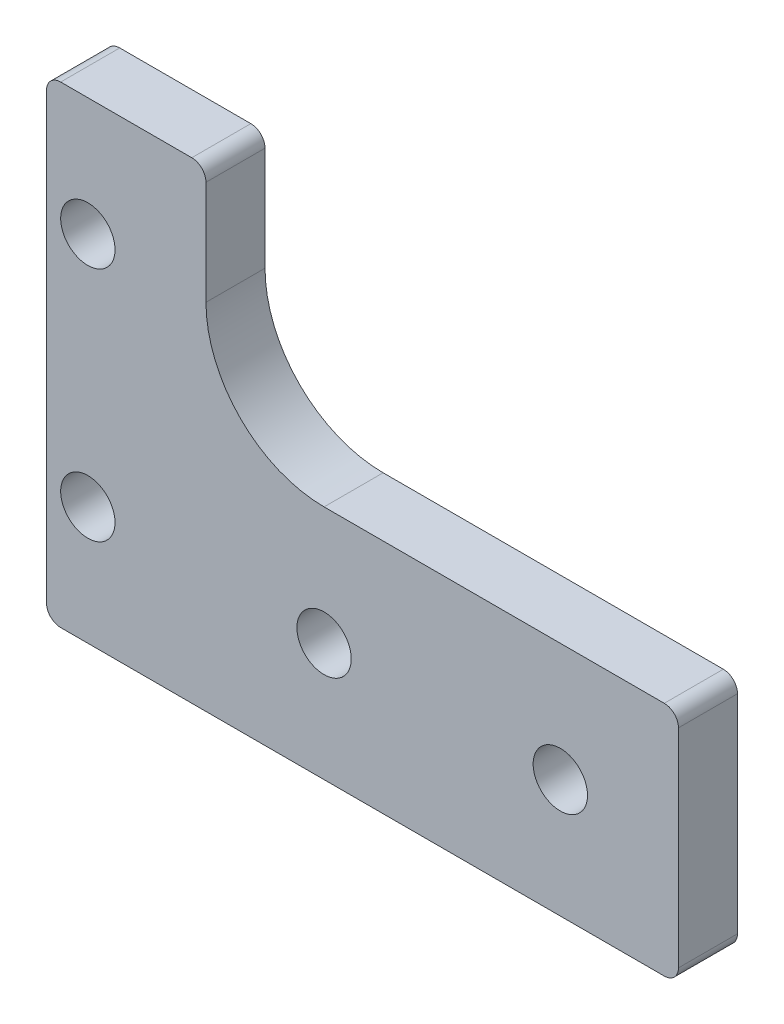
ISO-10303-21;
HEADER;
FILE_DESCRIPTION(('STEP AP214'),'2;1');
FILE_NAME('part.step','',(''),(''),'','','');
FILE_SCHEMA(('AUTOMOTIVE_DESIGN { 1 0 10303 214 1 1 1 1 }'));
ENDSEC;
DATA;
#1=APPLICATION_CONTEXT('core data for automotive mechanical design processes');
#2=APPLICATION_PROTOCOL_DEFINITION('international standard','automotive_design',2000,#1);
#3=PRODUCT_CONTEXT('',#1,'mechanical');
#4=PRODUCT('Part','Part','',(#3));
#5=PRODUCT_RELATED_PRODUCT_CATEGORY('part','',(#4));
#6=PRODUCT_DEFINITION_FORMATION('','',#4);
#7=PRODUCT_DEFINITION_CONTEXT('part definition',#1,'design');
#8=PRODUCT_DEFINITION('design','',#6,#7);
#9=PRODUCT_DEFINITION_SHAPE('','',#8);
#10=(LENGTH_UNIT() NAMED_UNIT(*) SI_UNIT(.MILLI.,.METRE.));
#11=(NAMED_UNIT(*) PLANE_ANGLE_UNIT() SI_UNIT($,.RADIAN.));
#12=(NAMED_UNIT(*) SI_UNIT($,.STERADIAN.) SOLID_ANGLE_UNIT());
#13=UNCERTAINTY_MEASURE_WITH_UNIT(LENGTH_MEASURE(1.E-05),#10,'distance_accuracy_value','');
#14=(GEOMETRIC_REPRESENTATION_CONTEXT(3) GLOBAL_UNCERTAINTY_ASSIGNED_CONTEXT((#13)) GLOBAL_UNIT_ASSIGNED_CONTEXT((#10,
#11,#12)) REPRESENTATION_CONTEXT('',''));
#15=CARTESIAN_POINT('',(0.,0.,0.));
#16=DIRECTION('',(0.,0.,1.));
#17=DIRECTION('',(1.,0.,0.));
#18=AXIS2_PLACEMENT_3D('',#15,#16,#17);
#19=CARTESIAN_POINT('',(76.2,0.,6.35));
#20=DIRECTION('',(0.,1.,0.));
#21=DIRECTION('',(-1.,0.,0.));
#22=AXIS2_PLACEMENT_3D('',#19,#20,#21);
#23=PLANE('',#22);
#24=DIRECTION('',(1.,0.,0.));
#25=VECTOR('',#24,1.);
#26=CARTESIAN_POINT('',(76.2,0.,0.));
#27=LINE('',#26,#25);
#28=CARTESIAN_POINT('',(9.77900000000002,0.,0.));
#29=VERTEX_POINT('',#28);
#30=CARTESIAN_POINT('',(74.676,0.,0.));
#31=VERTEX_POINT('',#30);
#32=EDGE_CURVE('E254',#29,#31,#27,.T.);
#33=ORIENTED_EDGE('',*,*,#32,.T.);
#34=DIRECTION('',(0.,0.,-1.));
#35=VECTOR('',#34,1.);
#36=CARTESIAN_POINT('',(74.676,0.,6.35));
#37=LINE('',#36,#35);
#38=CARTESIAN_POINT('',(74.676,0.,6.35));
#39=VERTEX_POINT('',#38);
#40=EDGE_CURVE('E196',#31,#39,#37,.F.);
#41=ORIENTED_EDGE('',*,*,#40,.T.);
#42=DIRECTION('',(1.,0.,0.));
#43=VECTOR('',#42,1.);
#44=CARTESIAN_POINT('',(76.2,0.,6.35));
#45=LINE('',#44,#43);
#46=CARTESIAN_POINT('',(9.77900000000002,0.,6.35));
#47=VERTEX_POINT('',#46);
#48=EDGE_CURVE('E162',#47,#39,#45,.T.);
#49=ORIENTED_EDGE('',*,*,#48,.F.);
#50=DIRECTION('',(0.,0.,1.));
#51=VECTOR('',#50,1.);
#52=CARTESIAN_POINT('',(9.779,0.,6.35));
#53=LINE('',#52,#51);
#54=EDGE_CURVE('E193',#47,#29,#53,.F.);
#55=ORIENTED_EDGE('',*,*,#54,.T.);
#56=EDGE_LOOP('',(#33,#41,#49,#55));
#57=FACE_BOUND('',#56,.T.);
#58=ADVANCED_FACE('F39',(#57),#23,.F.);
#59=CARTESIAN_POINT('',(76.2,25.4,6.35));
#60=DIRECTION('',(-1.,0.,0.));
#61=DIRECTION('',(0.,0.,1.));
#62=AXIS2_PLACEMENT_3D('',#59,#60,#61);
#63=PLANE('',#62);
#64=DIRECTION('',(0.,1.,0.));
#65=VECTOR('',#64,1.);
#66=CARTESIAN_POINT('',(76.2,25.4,6.35));
#67=LINE('',#66,#65);
#68=CARTESIAN_POINT('',(76.2,1.524,6.35));
#69=VERTEX_POINT('',#68);
#70=CARTESIAN_POINT('',(76.2,23.876,6.35));
#71=VERTEX_POINT('',#70);
#72=EDGE_CURVE('E271',#69,#71,#67,.T.);
#73=ORIENTED_EDGE('',*,*,#72,.F.);
#74=DIRECTION('',(0.,0.,-1.));
#75=VECTOR('',#74,1.);
#76=CARTESIAN_POINT('',(76.2,1.524,6.35));
#77=LINE('',#76,#75);
#78=CARTESIAN_POINT('',(76.2,1.524,0.));
#79=VERTEX_POINT('',#78);
#80=EDGE_CURVE('E175',#69,#79,#77,.T.);
#81=ORIENTED_EDGE('',*,*,#80,.T.);
#82=DIRECTION('',(0.,1.,0.));
#83=VECTOR('',#82,1.);
#84=CARTESIAN_POINT('',(76.2,25.4,0.));
#85=LINE('',#84,#83);
#86=CARTESIAN_POINT('',(76.2,23.876,0.));
#87=VERTEX_POINT('',#86);
#88=EDGE_CURVE('E164',#79,#87,#85,.T.);
#89=ORIENTED_EDGE('',*,*,#88,.T.);
#90=DIRECTION('',(0.,0.,-1.));
#91=VECTOR('',#90,1.);
#92=CARTESIAN_POINT('',(76.2,23.876,6.35));
#93=LINE('',#92,#91);
#94=EDGE_CURVE('E172',#87,#71,#93,.F.);
#95=ORIENTED_EDGE('',*,*,#94,.T.);
#96=EDGE_LOOP('',(#73,#81,#89,#95));
#97=FACE_BOUND('',#96,.T.);
#98=ADVANCED_FACE('F263',(#97),#63,.F.);
#99=CARTESIAN_POINT('',(25.4,25.4,6.35));
#100=DIRECTION('',(0.,-1.,0.));
#101=DIRECTION('',(1.,0.,0.));
#102=AXIS2_PLACEMENT_3D('',#99,#100,#101);
#103=PLANE('',#102);
#104=DIRECTION('',(-1.,0.,0.));
#105=VECTOR('',#104,1.);
#106=CARTESIAN_POINT('',(25.4,25.4,6.35));
#107=LINE('',#106,#105);
#108=CARTESIAN_POINT('',(74.676,25.4,6.35));
#109=VERTEX_POINT('',#108);
#110=CARTESIAN_POINT('',(38.1,25.4,6.35));
#111=VERTEX_POINT('',#110);
#112=EDGE_CURVE('E250',#109,#111,#107,.T.);
#113=ORIENTED_EDGE('',*,*,#112,.F.);
#114=DIRECTION('',(0.,0.,-1.));
#115=VECTOR('',#114,1.);
#116=CARTESIAN_POINT('',(74.676,25.4,6.35));
#117=LINE('',#116,#115);
#118=CARTESIAN_POINT('',(74.676,25.4,0.));
#119=VERTEX_POINT('',#118);
#120=EDGE_CURVE('E213',#109,#119,#117,.T.);
#121=ORIENTED_EDGE('',*,*,#120,.T.);
#122=DIRECTION('',(-1.,0.,0.));
#123=VECTOR('',#122,1.);
#124=CARTESIAN_POINT('',(25.4,25.4,0.));
#125=LINE('',#124,#123);
#126=CARTESIAN_POINT('',(38.1,25.4,0.));
#127=VERTEX_POINT('',#126);
#128=EDGE_CURVE('E157',#119,#127,#125,.T.);
#129=ORIENTED_EDGE('',*,*,#128,.T.);
#130=DIRECTION('',(0.,0.,-1.));
#131=VECTOR('',#130,1.);
#132=CARTESIAN_POINT('',(38.1,25.4,6.35));
#133=LINE('',#132,#131);
#134=EDGE_CURVE('E137',#127,#111,#133,.F.);
#135=ORIENTED_EDGE('',*,*,#134,.T.);
#136=EDGE_LOOP('',(#113,#121,#129,#135));
#137=FACE_BOUND('',#136,.T.);
#138=ADVANCED_FACE('F269',(#137),#103,.F.);
#139=CARTESIAN_POINT('',(25.4,50.8,6.35));
#140=DIRECTION('',(-1.,0.,0.));
#141=DIRECTION('',(0.,-1.,0.));
#142=AXIS2_PLACEMENT_3D('',#139,#140,#141);
#143=PLANE('',#142);
#144=DIRECTION('',(0.,1.,0.));
#145=VECTOR('',#144,1.);
#146=CARTESIAN_POINT('',(25.4,50.8,0.));
#147=LINE('',#146,#145);
#148=CARTESIAN_POINT('',(25.4,38.1,0.));
#149=VERTEX_POINT('',#148);
#150=CARTESIAN_POINT('',(25.4,49.276,0.));
#151=VERTEX_POINT('',#150);
#152=EDGE_CURVE('E145',#149,#151,#147,.T.);
#153=ORIENTED_EDGE('',*,*,#152,.T.);
#154=DIRECTION('',(0.,0.,-1.));
#155=VECTOR('',#154,1.);
#156=CARTESIAN_POINT('',(25.4,49.276,6.35));
#157=LINE('',#156,#155);
#158=CARTESIAN_POINT('',(25.4,49.276,6.35));
#159=VERTEX_POINT('',#158);
#160=EDGE_CURVE('E11',#151,#159,#157,.F.);
#161=ORIENTED_EDGE('',*,*,#160,.T.);
#162=DIRECTION('',(0.,1.,0.));
#163=VECTOR('',#162,1.);
#164=CARTESIAN_POINT('',(25.4,50.8,6.35));
#165=LINE('',#164,#163);
#166=CARTESIAN_POINT('',(25.4,38.1,6.35));
#167=VERTEX_POINT('',#166);
#168=EDGE_CURVE('E146',#167,#159,#165,.T.);
#169=ORIENTED_EDGE('',*,*,#168,.F.);
#170=DIRECTION('',(0.,0.,-1.));
#171=VECTOR('',#170,1.);
#172=CARTESIAN_POINT('',(25.4,38.1,0.));
#173=LINE('',#172,#171);
#174=EDGE_CURVE('E135',#167,#149,#173,.T.);
#175=ORIENTED_EDGE('',*,*,#174,.T.);
#176=EDGE_LOOP('',(#153,#161,#169,#175));
#177=FACE_BOUND('',#176,.T.);
#178=ADVANCED_FACE('F144',(#177),#143,.F.);
#179=CARTESIAN_POINT('',(0.,50.8,6.35));
#180=DIRECTION('',(0.,-1.,0.));
#181=DIRECTION('',(0.,0.,-1.));
#182=AXIS2_PLACEMENT_3D('',#179,#180,#181);
#183=PLANE('',#182);
#184=DIRECTION('',(-1.,0.,0.));
#185=VECTOR('',#184,1.);
#186=CARTESIAN_POINT('',(0.,50.8,6.35));
#187=LINE('',#186,#185);
#188=CARTESIAN_POINT('',(23.876,50.8,6.35));
#189=VERTEX_POINT('',#188);
#190=CARTESIAN_POINT('',(9.779,50.8,6.35));
#191=VERTEX_POINT('',#190);
#192=EDGE_CURVE('E148',#189,#191,#187,.T.);
#193=ORIENTED_EDGE('',*,*,#192,.F.);
#194=DIRECTION('',(0.,0.,-1.));
#195=VECTOR('',#194,1.);
#196=CARTESIAN_POINT('',(23.876,50.8,6.35));
#197=LINE('',#196,#195);
#198=CARTESIAN_POINT('',(23.876,50.8,0.));
#199=VERTEX_POINT('',#198);
#200=EDGE_CURVE('E48',#189,#199,#197,.T.);
#201=ORIENTED_EDGE('',*,*,#200,.T.);
#202=DIRECTION('',(-1.,0.,0.));
#203=VECTOR('',#202,1.);
#204=CARTESIAN_POINT('',(0.,50.8,0.));
#205=LINE('',#204,#203);
#206=CARTESIAN_POINT('',(9.779,50.8,0.));
#207=VERTEX_POINT('',#206);
#208=EDGE_CURVE('E156',#199,#207,#205,.T.);
#209=ORIENTED_EDGE('',*,*,#208,.T.);
#210=DIRECTION('',(0.,0.,1.));
#211=VECTOR('',#210,1.);
#212=CARTESIAN_POINT('',(9.779,50.8,6.35));
#213=LINE('',#212,#211);
#214=EDGE_CURVE('E224',#207,#191,#213,.T.);
#215=ORIENTED_EDGE('',*,*,#214,.T.);
#216=EDGE_LOOP('',(#193,#201,#209,#215));
#217=FACE_BOUND('',#216,.T.);
#218=ADVANCED_FACE('F232',(#217),#183,.F.);
#219=CARTESIAN_POINT('',(0.,0.,6.35));
#220=DIRECTION('',(0.,0.,-1.));
#221=DIRECTION('',(-1.,0.,0.));
#222=AXIS2_PLACEMENT_3D('',#219,#220,#221);
#223=PLANE('',#222);
#224=CARTESIAN_POINT('',(12.7,38.1,6.35));
#225=DIRECTION('',(0.,0.,1.));
#226=DIRECTION('',(1.,0.,0.));
#227=AXIS2_PLACEMENT_3D('',#224,#225,#226);
#228=CIRCLE('',#227,2.921);
#229=CARTESIAN_POINT('',(15.621,38.1,6.35));
#230=VERTEX_POINT('',#229);
#231=EDGE_CURVE('E301',#230,#230,#228,.T.);
#232=ORIENTED_EDGE('',*,*,#231,.F.);
#233=EDGE_LOOP('',(#232));
#234=FACE_BOUND('',#233,.T.);
#235=CARTESIAN_POINT('',(12.7,12.7,6.35));
#236=DIRECTION('',(0.,0.,1.));
#237=DIRECTION('',(1.,0.,0.));
#238=AXIS2_PLACEMENT_3D('',#235,#236,#237);
#239=CIRCLE('',#238,2.921);
#240=CARTESIAN_POINT('',(15.621,12.7,6.35));
#241=VERTEX_POINT('',#240);
#242=EDGE_CURVE('E293',#241,#241,#239,.T.);
#243=ORIENTED_EDGE('',*,*,#242,.F.);
#244=EDGE_LOOP('',(#243));
#245=FACE_BOUND('',#244,.T.);
#246=CARTESIAN_POINT('',(38.1,12.7,6.35));
#247=DIRECTION('',(0.,0.,1.));
#248=DIRECTION('',(1.,0.,0.));
#249=AXIS2_PLACEMENT_3D('',#246,#247,#248);
#250=CIRCLE('',#249,2.921);
#251=CARTESIAN_POINT('',(41.021,12.7,6.35));
#252=VERTEX_POINT('',#251);
#253=EDGE_CURVE('E285',#252,#252,#250,.T.);
#254=ORIENTED_EDGE('',*,*,#253,.F.);
#255=EDGE_LOOP('',(#254));
#256=FACE_BOUND('',#255,.T.);
#257=CARTESIAN_POINT('',(63.5,12.7,6.35));
#258=DIRECTION('',(0.,0.,1.));
#259=DIRECTION('',(1.,0.,0.));
#260=AXIS2_PLACEMENT_3D('',#257,#258,#259);
#261=CIRCLE('',#260,2.92100000000001);
#262=CARTESIAN_POINT('',(66.421,12.7,6.35));
#263=VERTEX_POINT('',#262);
#264=EDGE_CURVE('E277',#263,#263,#261,.T.);
#265=ORIENTED_EDGE('',*,*,#264,.F.);
#266=EDGE_LOOP('',(#265));
#267=FACE_BOUND('',#266,.T.);
#268=ORIENTED_EDGE('',*,*,#48,.T.);
#269=CARTESIAN_POINT('',(74.676,1.524,6.35));
#270=DIRECTION('',(0.,0.,-1.));
#271=DIRECTION('',(-1.,0.,0.));
#272=AXIS2_PLACEMENT_3D('',#269,#270,#271);
#273=CIRCLE('',#272,1.524);
#274=EDGE_CURVE('E210',#39,#69,#273,.F.);
#275=ORIENTED_EDGE('',*,*,#274,.T.);
#276=ORIENTED_EDGE('',*,*,#72,.T.);
#277=CARTESIAN_POINT('',(74.676,23.876,6.35));
#278=DIRECTION('',(0.,0.,-1.));
#279=DIRECTION('',(-1.,0.,0.));
#280=AXIS2_PLACEMENT_3D('',#277,#278,#279);
#281=CIRCLE('',#280,1.524);
#282=EDGE_CURVE('E61',#71,#109,#281,.F.);
#283=ORIENTED_EDGE('',*,*,#282,.T.);
#284=ORIENTED_EDGE('',*,*,#112,.T.);
#285=CARTESIAN_POINT('',(38.1,38.1,6.35));
#286=DIRECTION('',(0.,0.,-1.));
#287=DIRECTION('',(-1.,0.,0.));
#288=AXIS2_PLACEMENT_3D('',#285,#286,#287);
#289=CIRCLE('',#288,12.7);
#290=EDGE_CURVE('E142',#111,#167,#289,.T.);
#291=ORIENTED_EDGE('',*,*,#290,.T.);
#292=ORIENTED_EDGE('',*,*,#168,.T.);
#293=CARTESIAN_POINT('',(23.876,49.276,6.35));
#294=DIRECTION('',(0.,0.,-1.));
#295=DIRECTION('',(-1.,0.,0.));
#296=AXIS2_PLACEMENT_3D('',#293,#294,#295);
#297=CIRCLE('',#296,1.524);
#298=EDGE_CURVE('E202',#159,#189,#297,.F.);
#299=ORIENTED_EDGE('',*,*,#298,.T.);
#300=ORIENTED_EDGE('',*,*,#192,.T.);
#301=CARTESIAN_POINT('',(9.779,49.276,6.35));
#302=DIRECTION('',(0.,0.,-1.));
#303=DIRECTION('',(-1.,0.,0.));
#304=AXIS2_PLACEMENT_3D('',#301,#302,#303);
#305=CIRCLE('',#304,1.524);
#306=CARTESIAN_POINT('',(8.255,49.276,6.35));
#307=VERTEX_POINT('',#306);
#308=EDGE_CURVE('E199',#191,#307,#305,.F.);
#309=ORIENTED_EDGE('',*,*,#308,.T.);
#310=DIRECTION('',(0.,1.,0.));
#311=VECTOR('',#310,1.);
#312=CARTESIAN_POINT('',(8.255,0.,6.35));
#313=LINE('',#312,#311);
#314=CARTESIAN_POINT('',(8.255,1.524,6.35));
#315=VERTEX_POINT('',#314);
#316=EDGE_CURVE('E308',#315,#307,#313,.T.);
#317=ORIENTED_EDGE('',*,*,#316,.F.);
#318=CARTESIAN_POINT('',(9.779,1.524,6.35));
#319=DIRECTION('',(0.,0.,-1.));
#320=DIRECTION('',(-1.,0.,0.));
#321=AXIS2_PLACEMENT_3D('',#318,#319,#320);
#322=CIRCLE('',#321,1.524);
#323=EDGE_CURVE('E205',#315,#47,#322,.F.);
#324=ORIENTED_EDGE('',*,*,#323,.T.);
#325=EDGE_LOOP('',(#268,#275,#276,#283,#284,#291,#292,#299,#300,#309,#317,#324));
#326=FACE_BOUND('',#325,.T.);
#327=ADVANCED_FACE('F244',(#234,#245,#256,#267,#326),#223,.F.);
#328=CARTESIAN_POINT('',(0.,0.,0.));
#329=DIRECTION('',(0.,0.,-1.));
#330=DIRECTION('',(-1.,0.,0.));
#331=AXIS2_PLACEMENT_3D('',#328,#329,#330);
#332=PLANE('',#331);
#333=ORIENTED_EDGE('',*,*,#88,.F.);
#334=CARTESIAN_POINT('',(74.676,1.524,0.));
#335=DIRECTION('',(0.,0.,-1.));
#336=DIRECTION('',(-1.,0.,0.));
#337=AXIS2_PLACEMENT_3D('',#334,#335,#336);
#338=CIRCLE('',#337,1.524);
#339=EDGE_CURVE('E190',#79,#31,#338,.T.);
#340=ORIENTED_EDGE('',*,*,#339,.T.);
#341=ORIENTED_EDGE('',*,*,#32,.F.);
#342=CARTESIAN_POINT('',(9.779,1.524,0.));
#343=DIRECTION('',(0.,0.,-1.));
#344=DIRECTION('',(-1.,0.,0.));
#345=AXIS2_PLACEMENT_3D('',#342,#343,#344);
#346=CIRCLE('',#345,1.524);
#347=CARTESIAN_POINT('',(8.255,1.524,0.));
#348=VERTEX_POINT('',#347);
#349=EDGE_CURVE('E184',#29,#348,#346,.T.);
#350=ORIENTED_EDGE('',*,*,#349,.T.);
#351=DIRECTION('',(0.,1.,0.));
#352=VECTOR('',#351,1.);
#353=CARTESIAN_POINT('',(8.255,0.,0.));
#354=LINE('',#353,#352);
#355=CARTESIAN_POINT('',(8.255,49.276,0.));
#356=VERTEX_POINT('',#355);
#357=EDGE_CURVE('E240',#348,#356,#354,.T.);
#358=ORIENTED_EDGE('',*,*,#357,.T.);
#359=CARTESIAN_POINT('',(9.779,49.276,0.));
#360=DIRECTION('',(0.,0.,-1.));
#361=DIRECTION('',(-1.,0.,0.));
#362=AXIS2_PLACEMENT_3D('',#359,#360,#361);
#363=CIRCLE('',#362,1.524);
#364=EDGE_CURVE('E179',#356,#207,#363,.T.);
#365=ORIENTED_EDGE('',*,*,#364,.T.);
#366=ORIENTED_EDGE('',*,*,#208,.F.);
#367=CARTESIAN_POINT('',(23.876,49.276,0.));
#368=DIRECTION('',(0.,0.,-1.));
#369=DIRECTION('',(-1.,0.,0.));
#370=AXIS2_PLACEMENT_3D('',#367,#368,#369);
#371=CIRCLE('',#370,1.524);
#372=EDGE_CURVE('E154',#199,#151,#371,.T.);
#373=ORIENTED_EDGE('',*,*,#372,.T.);
#374=ORIENTED_EDGE('',*,*,#152,.F.);
#375=CARTESIAN_POINT('',(38.1,38.1,0.));
#376=DIRECTION('',(0.,0.,-1.));
#377=DIRECTION('',(-1.,0.,0.));
#378=AXIS2_PLACEMENT_3D('',#375,#376,#377);
#379=CIRCLE('',#378,12.7);
#380=EDGE_CURVE('E131',#149,#127,#379,.F.);
#381=ORIENTED_EDGE('',*,*,#380,.T.);
#382=ORIENTED_EDGE('',*,*,#128,.F.);
#383=CARTESIAN_POINT('',(74.676,23.876,0.));
#384=DIRECTION('',(0.,0.,-1.));
#385=DIRECTION('',(-1.,0.,0.));
#386=AXIS2_PLACEMENT_3D('',#383,#384,#385);
#387=CIRCLE('',#386,1.524);
#388=EDGE_CURVE('E187',#119,#87,#387,.T.);
#389=ORIENTED_EDGE('',*,*,#388,.T.);
#390=EDGE_LOOP('',(#333,#340,#341,#350,#358,#365,#366,#373,#374,#381,#382,#389));
#391=FACE_BOUND('',#390,.T.);
#392=CARTESIAN_POINT('',(12.7,38.1,0.));
#393=DIRECTION('',(0.,0.,1.));
#394=DIRECTION('',(1.,0.,0.));
#395=AXIS2_PLACEMENT_3D('',#392,#393,#394);
#396=CIRCLE('',#395,2.921);
#397=CARTESIAN_POINT('',(15.621,38.1,0.));
#398=VERTEX_POINT('',#397);
#399=EDGE_CURVE('E257',#398,#398,#396,.T.);
#400=ORIENTED_EDGE('',*,*,#399,.T.);
#401=EDGE_LOOP('',(#400));
#402=FACE_BOUND('',#401,.T.);
#403=CARTESIAN_POINT('',(12.7,12.7,0.));
#404=DIRECTION('',(0.,0.,1.));
#405=DIRECTION('',(1.,0.,0.));
#406=AXIS2_PLACEMENT_3D('',#403,#404,#405);
#407=CIRCLE('',#406,2.921);
#408=CARTESIAN_POINT('',(15.621,12.7,0.));
#409=VERTEX_POINT('',#408);
#410=EDGE_CURVE('E297',#409,#409,#407,.T.);
#411=ORIENTED_EDGE('',*,*,#410,.T.);
#412=EDGE_LOOP('',(#411));
#413=FACE_BOUND('',#412,.T.);
#414=CARTESIAN_POINT('',(38.1,12.7,0.));
#415=DIRECTION('',(0.,0.,1.));
#416=DIRECTION('',(1.,0.,0.));
#417=AXIS2_PLACEMENT_3D('',#414,#415,#416);
#418=CIRCLE('',#417,2.921);
#419=CARTESIAN_POINT('',(41.021,12.7,0.));
#420=VERTEX_POINT('',#419);
#421=EDGE_CURVE('E289',#420,#420,#418,.T.);
#422=ORIENTED_EDGE('',*,*,#421,.T.);
#423=EDGE_LOOP('',(#422));
#424=FACE_BOUND('',#423,.T.);
#425=CARTESIAN_POINT('',(63.5,12.7,0.));
#426=DIRECTION('',(0.,0.,1.));
#427=DIRECTION('',(1.,0.,0.));
#428=AXIS2_PLACEMENT_3D('',#425,#426,#427);
#429=CIRCLE('',#428,2.92100000000001);
#430=CARTESIAN_POINT('',(66.421,12.7,0.));
#431=VERTEX_POINT('',#430);
#432=EDGE_CURVE('E281',#431,#431,#429,.T.);
#433=ORIENTED_EDGE('',*,*,#432,.T.);
#434=EDGE_LOOP('',(#433));
#435=FACE_BOUND('',#434,.T.);
#436=ADVANCED_FACE('F151',(#391,#402,#413,#424,#435),#332,.T.);
#437=CARTESIAN_POINT('',(63.5,12.7,0.));
#438=DIRECTION('',(0.,0.,1.));
#439=DIRECTION('',(1.,0.,0.));
#440=AXIS2_PLACEMENT_3D('',#437,#438,#439);
#441=CYLINDRICAL_SURFACE('',#440,2.92100000000001);
#442=ORIENTED_EDGE('',*,*,#432,.F.);
#443=EDGE_LOOP('',(#442));
#444=FACE_BOUND('',#443,.T.);
#445=ORIENTED_EDGE('',*,*,#264,.T.);
#446=EDGE_LOOP('',(#445));
#447=FACE_BOUND('',#446,.T.);
#448=ADVANCED_FACE('F349',(#444,#447),#441,.F.);
#449=CARTESIAN_POINT('',(38.1,12.7,0.));
#450=DIRECTION('',(0.,0.,1.));
#451=DIRECTION('',(1.,0.,0.));
#452=AXIS2_PLACEMENT_3D('',#449,#450,#451);
#453=CYLINDRICAL_SURFACE('',#452,2.921);
#454=ORIENTED_EDGE('',*,*,#421,.F.);
#455=EDGE_LOOP('',(#454));
#456=FACE_BOUND('',#455,.T.);
#457=ORIENTED_EDGE('',*,*,#253,.T.);
#458=EDGE_LOOP('',(#457));
#459=FACE_BOUND('',#458,.T.);
#460=ADVANCED_FACE('F355',(#456,#459),#453,.F.);
#461=CARTESIAN_POINT('',(12.7,12.7,0.));
#462=DIRECTION('',(0.,0.,1.));
#463=DIRECTION('',(1.,0.,0.));
#464=AXIS2_PLACEMENT_3D('',#461,#462,#463);
#465=CYLINDRICAL_SURFACE('',#464,2.921);
#466=ORIENTED_EDGE('',*,*,#410,.F.);
#467=EDGE_LOOP('',(#466));
#468=FACE_BOUND('',#467,.T.);
#469=ORIENTED_EDGE('',*,*,#242,.T.);
#470=EDGE_LOOP('',(#469));
#471=FACE_BOUND('',#470,.T.);
#472=ADVANCED_FACE('F359',(#468,#471),#465,.F.);
#473=CARTESIAN_POINT('',(12.7,38.1,0.));
#474=DIRECTION('',(0.,0.,1.));
#475=DIRECTION('',(1.,0.,0.));
#476=AXIS2_PLACEMENT_3D('',#473,#474,#475);
#477=CYLINDRICAL_SURFACE('',#476,2.921);
#478=ORIENTED_EDGE('',*,*,#399,.F.);
#479=EDGE_LOOP('',(#478));
#480=FACE_BOUND('',#479,.T.);
#481=ORIENTED_EDGE('',*,*,#231,.T.);
#482=EDGE_LOOP('',(#481));
#483=FACE_BOUND('',#482,.T.);
#484=ADVANCED_FACE('F363',(#480,#483),#477,.F.);
#485=CARTESIAN_POINT('',(8.255,0.,0.));
#486=DIRECTION('',(1.,0.,0.));
#487=DIRECTION('',(0.,0.,-1.));
#488=AXIS2_PLACEMENT_3D('',#485,#486,#487);
#489=PLANE('',#488);
#490=ORIENTED_EDGE('',*,*,#357,.F.);
#491=DIRECTION('',(0.,0.,1.));
#492=VECTOR('',#491,1.);
#493=CARTESIAN_POINT('',(8.255,1.524,0.));
#494=LINE('',#493,#492);
#495=EDGE_CURVE('E220',#348,#315,#494,.T.);
#496=ORIENTED_EDGE('',*,*,#495,.T.);
#497=ORIENTED_EDGE('',*,*,#316,.T.);
#498=DIRECTION('',(0.,0.,1.));
#499=VECTOR('',#498,1.);
#500=CARTESIAN_POINT('',(8.255,49.276,0.));
#501=LINE('',#500,#499);
#502=EDGE_CURVE('E217',#307,#356,#501,.F.);
#503=ORIENTED_EDGE('',*,*,#502,.T.);
#504=EDGE_LOOP('',(#490,#496,#497,#503));
#505=FACE_BOUND('',#504,.T.);
#506=ADVANCED_FACE('F313',(#505),#489,.F.);
#507=CARTESIAN_POINT('',(38.1,38.1,6.35));
#508=DIRECTION('',(0.,0.,1.));
#509=DIRECTION('',(1.,0.,0.));
#510=AXIS2_PLACEMENT_3D('',#507,#508,#509);
#511=CYLINDRICAL_SURFACE('',#510,12.7);
#512=ORIENTED_EDGE('',*,*,#290,.F.);
#513=ORIENTED_EDGE('',*,*,#134,.F.);
#514=ORIENTED_EDGE('',*,*,#380,.F.);
#515=ORIENTED_EDGE('',*,*,#174,.F.);
#516=EDGE_LOOP('',(#512,#513,#514,#515));
#517=FACE_BOUND('',#516,.T.);
#518=ADVANCED_FACE('F134',(#517),#511,.F.);
#519=CARTESIAN_POINT('',(74.676,1.524,6.35));
#520=DIRECTION('',(0.,0.,-1.));
#521=DIRECTION('',(-1.,0.,0.));
#522=AXIS2_PLACEMENT_3D('',#519,#520,#521);
#523=CYLINDRICAL_SURFACE('',#522,1.524);
#524=ORIENTED_EDGE('',*,*,#274,.F.);
#525=ORIENTED_EDGE('',*,*,#40,.F.);
#526=ORIENTED_EDGE('',*,*,#339,.F.);
#527=ORIENTED_EDGE('',*,*,#80,.F.);
#528=EDGE_LOOP('',(#524,#525,#526,#527));
#529=FACE_BOUND('',#528,.T.);
#530=ADVANCED_FACE('F325',(#529),#523,.T.);
#531=CARTESIAN_POINT('',(74.676,23.876,6.35));
#532=DIRECTION('',(0.,0.,-1.));
#533=DIRECTION('',(-1.,0.,0.));
#534=AXIS2_PLACEMENT_3D('',#531,#532,#533);
#535=CYLINDRICAL_SURFACE('',#534,1.524);
#536=ORIENTED_EDGE('',*,*,#282,.F.);
#537=ORIENTED_EDGE('',*,*,#94,.F.);
#538=ORIENTED_EDGE('',*,*,#388,.F.);
#539=ORIENTED_EDGE('',*,*,#120,.F.);
#540=EDGE_LOOP('',(#536,#537,#538,#539));
#541=FACE_BOUND('',#540,.T.);
#542=ADVANCED_FACE('F266',(#541),#535,.T.);
#543=CARTESIAN_POINT('',(9.779,1.524,0.));
#544=DIRECTION('',(0.,0.,1.));
#545=DIRECTION('',(1.,0.,0.));
#546=AXIS2_PLACEMENT_3D('',#543,#544,#545);
#547=CYLINDRICAL_SURFACE('',#546,1.524);
#548=ORIENTED_EDGE('',*,*,#349,.F.);
#549=ORIENTED_EDGE('',*,*,#54,.F.);
#550=ORIENTED_EDGE('',*,*,#323,.F.);
#551=ORIENTED_EDGE('',*,*,#495,.F.);
#552=EDGE_LOOP('',(#548,#549,#550,#551));
#553=FACE_BOUND('',#552,.T.);
#554=ADVANCED_FACE('F323',(#553),#547,.T.);
#555=CARTESIAN_POINT('',(23.876,49.276,6.35));
#556=DIRECTION('',(0.,0.,-1.));
#557=DIRECTION('',(-1.,0.,0.));
#558=AXIS2_PLACEMENT_3D('',#555,#556,#557);
#559=CYLINDRICAL_SURFACE('',#558,1.524);
#560=ORIENTED_EDGE('',*,*,#298,.F.);
#561=ORIENTED_EDGE('',*,*,#160,.F.);
#562=ORIENTED_EDGE('',*,*,#372,.F.);
#563=ORIENTED_EDGE('',*,*,#200,.F.);
#564=EDGE_LOOP('',(#560,#561,#562,#563));
#565=FACE_BOUND('',#564,.T.);
#566=ADVANCED_FACE('F460',(#565),#559,.T.);
#567=CARTESIAN_POINT('',(9.779,49.276,6.35));
#568=DIRECTION('',(0.,0.,1.));
#569=DIRECTION('',(1.,0.,0.));
#570=AXIS2_PLACEMENT_3D('',#567,#568,#569);
#571=CYLINDRICAL_SURFACE('',#570,1.524);
#572=ORIENTED_EDGE('',*,*,#364,.F.);
#573=ORIENTED_EDGE('',*,*,#502,.F.);
#574=ORIENTED_EDGE('',*,*,#308,.F.);
#575=ORIENTED_EDGE('',*,*,#214,.F.);
#576=EDGE_LOOP('',(#572,#573,#574,#575));
#577=FACE_BOUND('',#576,.T.);
#578=ADVANCED_FACE('F41',(#577),#571,.T.);
#579=CLOSED_SHELL('',(#58,#98,#138,#178,#218,#327,#436,#448,#460,#472,#484,#506,#518,#530,#542,
#554,#566,#578));
#580=MANIFOLD_SOLID_BREP('B2',#579);
#581=ADVANCED_BREP_SHAPE_REPRESENTATION('',(#18,#580),#14);
#582=SHAPE_DEFINITION_REPRESENTATION(#9,#581);
ENDSEC;
END-ISO-10303-21;
